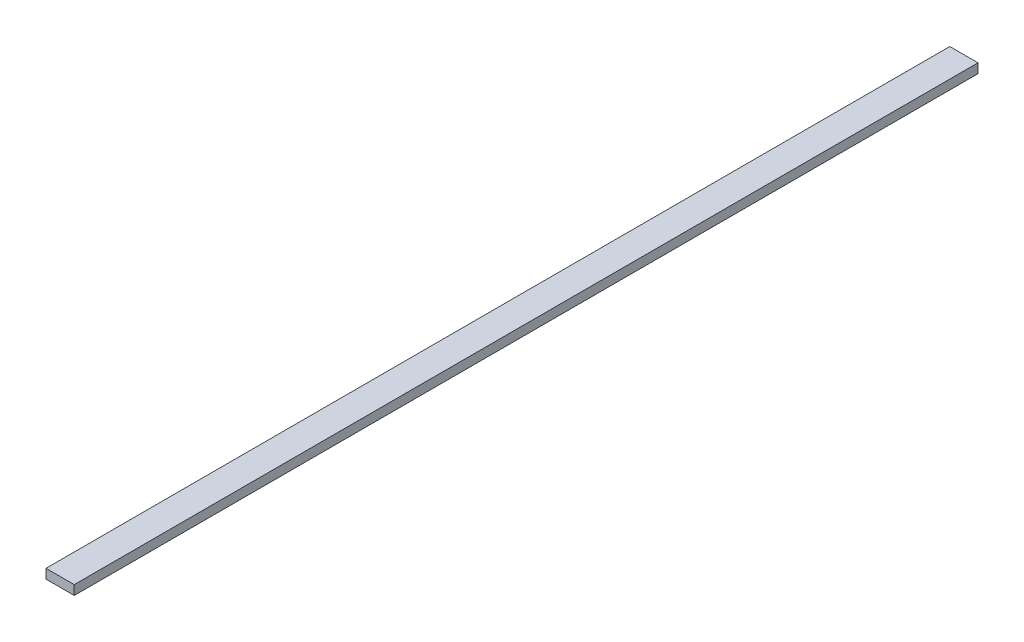
ISO-10303-21;
HEADER;
FILE_DESCRIPTION(('STEP AP214'),'2;1');
FILE_NAME('part.step','',(''),(''),'','','');
FILE_SCHEMA(('AUTOMOTIVE_DESIGN { 1 0 10303 214 1 1 1 1 }'));
ENDSEC;
DATA;
#1=APPLICATION_CONTEXT('core data for automotive mechanical design processes');
#2=APPLICATION_PROTOCOL_DEFINITION('international standard','automotive_design',2000,#1);
#3=PRODUCT_CONTEXT('',#1,'mechanical');
#4=PRODUCT('Part','Part','',(#3));
#5=PRODUCT_RELATED_PRODUCT_CATEGORY('part','',(#4));
#6=PRODUCT_DEFINITION_FORMATION('','',#4);
#7=PRODUCT_DEFINITION_CONTEXT('part definition',#1,'design');
#8=PRODUCT_DEFINITION('design','',#6,#7);
#9=PRODUCT_DEFINITION_SHAPE('','',#8);
#10=(LENGTH_UNIT() NAMED_UNIT(*) SI_UNIT(.MILLI.,.METRE.));
#11=(NAMED_UNIT(*) PLANE_ANGLE_UNIT() SI_UNIT($,.RADIAN.));
#12=(NAMED_UNIT(*) SI_UNIT($,.STERADIAN.) SOLID_ANGLE_UNIT());
#13=UNCERTAINTY_MEASURE_WITH_UNIT(LENGTH_MEASURE(1.E-05),#10,'distance_accuracy_value','');
#14=(GEOMETRIC_REPRESENTATION_CONTEXT(3) GLOBAL_UNCERTAINTY_ASSIGNED_CONTEXT((#13)) GLOBAL_UNIT_ASSIGNED_CONTEXT((#10,
#11,#12)) REPRESENTATION_CONTEXT('',''));
#15=CARTESIAN_POINT('',(0.,0.,0.));
#16=DIRECTION('',(0.,0.,1.));
#17=DIRECTION('',(1.,0.,0.));
#18=AXIS2_PLACEMENT_3D('',#15,#16,#17);
#19=CARTESIAN_POINT('',(0.,0.,1219.2));
#20=DIRECTION('',(1.,0.,0.));
#21=DIRECTION('',(0.,0.,-1.));
#22=AXIS2_PLACEMENT_3D('',#19,#20,#21);
#23=PLANE('',#22);
#24=DIRECTION('',(0.,-1.,0.));
#25=VECTOR('',#24,1.);
#26=CARTESIAN_POINT('',(0.,0.,0.));
#27=LINE('',#26,#25);
#28=CARTESIAN_POINT('',(0.,12.7,0.));
#29=VERTEX_POINT('',#28);
#30=CARTESIAN_POINT('',(0.,0.,0.));
#31=VERTEX_POINT('',#30);
#32=EDGE_CURVE('E98',#29,#31,#27,.T.);
#33=ORIENTED_EDGE('',*,*,#32,.T.);
#34=DIRECTION('',(0.,0.,-1.));
#35=VECTOR('',#34,1.);
#36=CARTESIAN_POINT('',(0.,0.,1219.2));
#37=LINE('',#36,#35);
#38=CARTESIAN_POINT('',(0.,0.,1219.2));
#39=VERTEX_POINT('',#38);
#40=EDGE_CURVE('E11',#39,#31,#37,.T.);
#41=ORIENTED_EDGE('',*,*,#40,.F.);
#42=DIRECTION('',(0.,-1.,0.));
#43=VECTOR('',#42,1.);
#44=CARTESIAN_POINT('',(0.,0.,1219.2));
#45=LINE('',#44,#43);
#46=CARTESIAN_POINT('',(0.,12.7,1219.2));
#47=VERTEX_POINT('',#46);
#48=EDGE_CURVE('E86',#47,#39,#45,.T.);
#49=ORIENTED_EDGE('',*,*,#48,.F.);
#50=DIRECTION('',(0.,0.,-1.));
#51=VECTOR('',#50,1.);
#52=CARTESIAN_POINT('',(0.,12.7,1219.2));
#53=LINE('',#52,#51);
#54=EDGE_CURVE('E94',#47,#29,#53,.T.);
#55=ORIENTED_EDGE('',*,*,#54,.T.);
#56=EDGE_LOOP('',(#33,#41,#49,#55));
#57=FACE_BOUND('',#56,.T.);
#58=ADVANCED_FACE('F35',(#57),#23,.F.);
#59=CARTESIAN_POINT('',(0.,0.,1219.2));
#60=DIRECTION('',(0.,1.,0.));
#61=DIRECTION('',(0.,0.,1.));
#62=AXIS2_PLACEMENT_3D('',#59,#60,#61);
#63=PLANE('',#62);
#64=DIRECTION('',(1.,0.,0.));
#65=VECTOR('',#64,1.);
#66=CARTESIAN_POINT('',(0.,0.,0.));
#67=LINE('',#66,#65);
#68=CARTESIAN_POINT('',(38.1,0.,0.));
#69=VERTEX_POINT('',#68);
#70=EDGE_CURVE('E90',#31,#69,#67,.T.);
#71=ORIENTED_EDGE('',*,*,#70,.T.);
#72=DIRECTION('',(0.,0.,-1.));
#73=VECTOR('',#72,1.);
#74=CARTESIAN_POINT('',(38.1,0.,1219.2));
#75=LINE('',#74,#73);
#76=CARTESIAN_POINT('',(38.1,0.,1219.2));
#77=VERTEX_POINT('',#76);
#78=EDGE_CURVE('E43',#77,#69,#75,.T.);
#79=ORIENTED_EDGE('',*,*,#78,.F.);
#80=DIRECTION('',(1.,0.,0.));
#81=VECTOR('',#80,1.);
#82=CARTESIAN_POINT('',(0.,0.,1219.2));
#83=LINE('',#82,#81);
#84=EDGE_CURVE('E81',#39,#77,#83,.T.);
#85=ORIENTED_EDGE('',*,*,#84,.F.);
#86=ORIENTED_EDGE('',*,*,#40,.T.);
#87=EDGE_LOOP('',(#71,#79,#85,#86));
#88=FACE_BOUND('',#87,.T.);
#89=ADVANCED_FACE('F89',(#88),#63,.F.);
#90=CARTESIAN_POINT('',(38.1,0.,1219.2));
#91=DIRECTION('',(-1.,0.,0.));
#92=DIRECTION('',(0.,-1.,0.));
#93=AXIS2_PLACEMENT_3D('',#90,#91,#92);
#94=PLANE('',#93);
#95=DIRECTION('',(0.,1.,0.));
#96=VECTOR('',#95,1.);
#97=CARTESIAN_POINT('',(38.1,0.,0.));
#98=LINE('',#97,#96);
#99=CARTESIAN_POINT('',(38.1,12.7,0.));
#100=VERTEX_POINT('',#99);
#101=EDGE_CURVE('E68',#69,#100,#98,.T.);
#102=ORIENTED_EDGE('',*,*,#101,.T.);
#103=DIRECTION('',(0.,0.,-1.));
#104=VECTOR('',#103,1.);
#105=CARTESIAN_POINT('',(38.1,12.7,1219.2));
#106=LINE('',#105,#104);
#107=CARTESIAN_POINT('',(38.1,12.7,1219.2));
#108=VERTEX_POINT('',#107);
#109=EDGE_CURVE('E91',#108,#100,#106,.T.);
#110=ORIENTED_EDGE('',*,*,#109,.F.);
#111=DIRECTION('',(0.,1.,0.));
#112=VECTOR('',#111,1.);
#113=CARTESIAN_POINT('',(38.1,0.,1219.2));
#114=LINE('',#113,#112);
#115=EDGE_CURVE('E84',#77,#108,#114,.T.);
#116=ORIENTED_EDGE('',*,*,#115,.F.);
#117=ORIENTED_EDGE('',*,*,#78,.T.);
#118=EDGE_LOOP('',(#102,#110,#116,#117));
#119=FACE_BOUND('',#118,.T.);
#120=ADVANCED_FACE('F92',(#119),#94,.F.);
#121=CARTESIAN_POINT('',(0.,12.7,1219.2));
#122=DIRECTION('',(0.,-1.,0.));
#123=DIRECTION('',(1.,0.,0.));
#124=AXIS2_PLACEMENT_3D('',#121,#122,#123);
#125=PLANE('',#124);
#126=DIRECTION('',(-1.,0.,0.));
#127=VECTOR('',#126,1.);
#128=CARTESIAN_POINT('',(0.,12.7,0.));
#129=LINE('',#128,#127);
#130=EDGE_CURVE('E74',#100,#29,#129,.T.);
#131=ORIENTED_EDGE('',*,*,#130,.T.);
#132=ORIENTED_EDGE('',*,*,#54,.F.);
#133=DIRECTION('',(-1.,0.,0.));
#134=VECTOR('',#133,1.);
#135=CARTESIAN_POINT('',(0.,12.7,1219.2));
#136=LINE('',#135,#134);
#137=EDGE_CURVE('E51',#108,#47,#136,.T.);
#138=ORIENTED_EDGE('',*,*,#137,.F.);
#139=ORIENTED_EDGE('',*,*,#109,.T.);
#140=EDGE_LOOP('',(#131,#132,#138,#139));
#141=FACE_BOUND('',#140,.T.);
#142=ADVANCED_FACE('F105',(#141),#125,.F.);
#143=CARTESIAN_POINT('',(0.,0.,1219.2));
#144=DIRECTION('',(0.,0.,-1.));
#145=DIRECTION('',(-1.,0.,0.));
#146=AXIS2_PLACEMENT_3D('',#143,#144,#145);
#147=PLANE('',#146);
#148=ORIENTED_EDGE('',*,*,#48,.T.);
#149=ORIENTED_EDGE('',*,*,#84,.T.);
#150=ORIENTED_EDGE('',*,*,#115,.T.);
#151=ORIENTED_EDGE('',*,*,#137,.T.);
#152=EDGE_LOOP('',(#148,#149,#150,#151));
#153=FACE_BOUND('',#152,.T.);
#154=ADVANCED_FACE('F82',(#153),#147,.F.);
#155=CARTESIAN_POINT('',(0.,0.,0.));
#156=DIRECTION('',(0.,0.,-1.));
#157=DIRECTION('',(-1.,0.,0.));
#158=AXIS2_PLACEMENT_3D('',#155,#156,#157);
#159=PLANE('',#158);
#160=ORIENTED_EDGE('',*,*,#32,.F.);
#161=ORIENTED_EDGE('',*,*,#130,.F.);
#162=ORIENTED_EDGE('',*,*,#101,.F.);
#163=ORIENTED_EDGE('',*,*,#70,.F.);
#164=EDGE_LOOP('',(#160,#161,#162,#163));
#165=FACE_BOUND('',#164,.T.);
#166=ADVANCED_FACE('F108',(#165),#159,.T.);
#167=CLOSED_SHELL('',(#58,#89,#120,#142,#154,#166));
#168=MANIFOLD_SOLID_BREP('B2',#167);
#169=ADVANCED_BREP_SHAPE_REPRESENTATION('',(#18,#168),#14);
#170=SHAPE_DEFINITION_REPRESENTATION(#9,#169);
ENDSEC;
END-ISO-10303-21;
